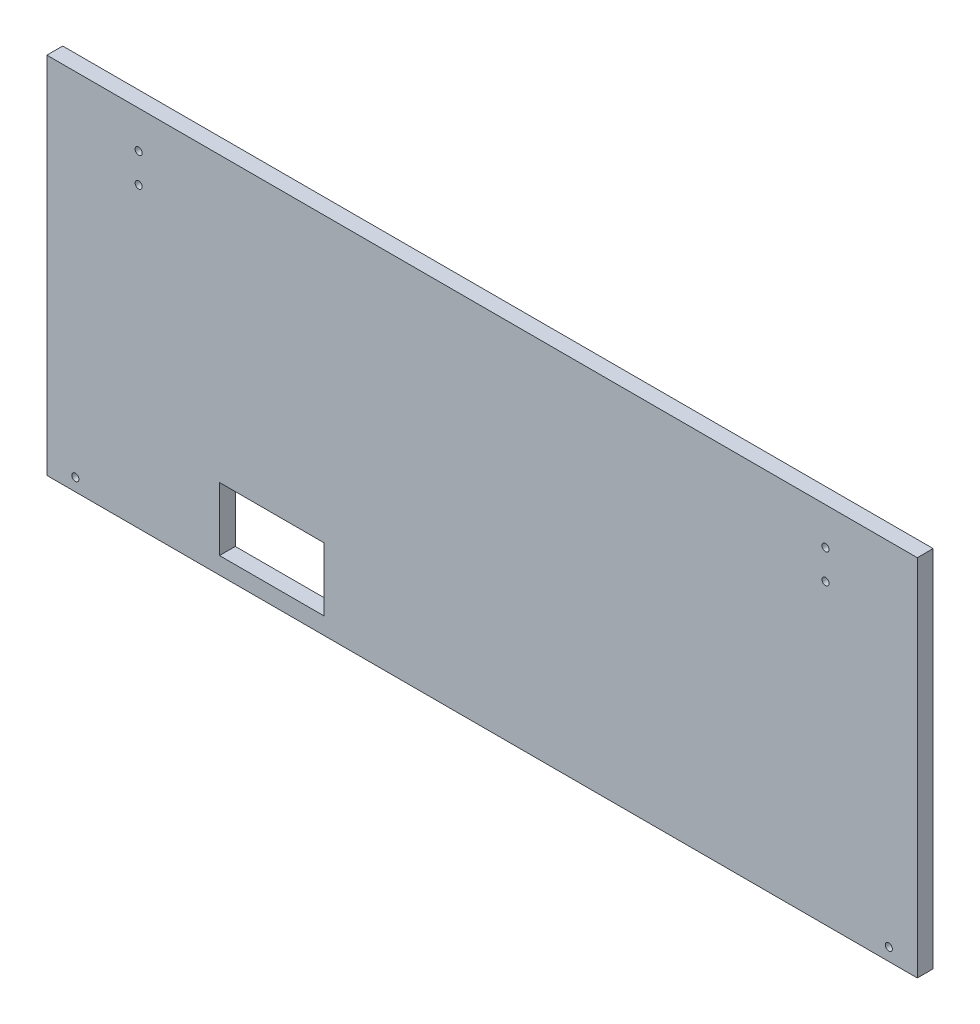
ISO-10303-21;
HEADER;
FILE_DESCRIPTION(('STEP AP214'),'2;1');
FILE_NAME('part.step','',(''),(''),'','','');
FILE_SCHEMA(('AUTOMOTIVE_DESIGN { 1 0 10303 214 1 1 1 1 }'));
ENDSEC;
DATA;
#1=APPLICATION_CONTEXT('core data for automotive mechanical design processes');
#2=APPLICATION_PROTOCOL_DEFINITION('international standard','automotive_design',2000,#1);
#3=PRODUCT_CONTEXT('',#1,'mechanical');
#4=PRODUCT('Part','Part','',(#3));
#5=PRODUCT_RELATED_PRODUCT_CATEGORY('part','',(#4));
#6=PRODUCT_DEFINITION_FORMATION('','',#4);
#7=PRODUCT_DEFINITION_CONTEXT('part definition',#1,'design');
#8=PRODUCT_DEFINITION('design','',#6,#7);
#9=PRODUCT_DEFINITION_SHAPE('','',#8);
#10=(LENGTH_UNIT() NAMED_UNIT(*) SI_UNIT(.MILLI.,.METRE.));
#11=(NAMED_UNIT(*) PLANE_ANGLE_UNIT() SI_UNIT($,.RADIAN.));
#12=(NAMED_UNIT(*) SI_UNIT($,.STERADIAN.) SOLID_ANGLE_UNIT());
#13=UNCERTAINTY_MEASURE_WITH_UNIT(LENGTH_MEASURE(1.E-05),#10,'distance_accuracy_value','');
#14=(GEOMETRIC_REPRESENTATION_CONTEXT(3) GLOBAL_UNCERTAINTY_ASSIGNED_CONTEXT((#13)) GLOBAL_UNIT_ASSIGNED_CONTEXT((#10,
#11,#12)) REPRESENTATION_CONTEXT('',''));
#15=CARTESIAN_POINT('',(0.,0.,0.));
#16=DIRECTION('',(0.,0.,1.));
#17=DIRECTION('',(1.,0.,0.));
#18=AXIS2_PLACEMENT_3D('',#15,#16,#17);
#19=CARTESIAN_POINT('',(275.,-115.,10.));
#20=DIRECTION('',(-1.,0.,0.));
#21=DIRECTION('',(0.,0.,1.));
#22=AXIS2_PLACEMENT_3D('',#19,#20,#21);
#23=PLANE('',#22);
#24=DIRECTION('',(0.,1.,0.));
#25=VECTOR('',#24,1.);
#26=CARTESIAN_POINT('',(275.,-115.,0.));
#27=LINE('',#26,#25);
#28=CARTESIAN_POINT('',(275.,-115.,0.));
#29=VERTEX_POINT('',#28);
#30=CARTESIAN_POINT('',(275.,115.,0.));
#31=VERTEX_POINT('',#30);
#32=EDGE_CURVE('E170',#29,#31,#27,.T.);
#33=ORIENTED_EDGE('',*,*,#32,.T.);
#34=DIRECTION('',(0.,0.,-1.));
#35=VECTOR('',#34,1.);
#36=CARTESIAN_POINT('',(275.,115.,10.));
#37=LINE('',#36,#35);
#38=CARTESIAN_POINT('',(275.,115.,10.));
#39=VERTEX_POINT('',#38);
#40=EDGE_CURVE('E11',#39,#31,#37,.T.);
#41=ORIENTED_EDGE('',*,*,#40,.F.);
#42=DIRECTION('',(0.,1.,0.));
#43=VECTOR('',#42,1.);
#44=CARTESIAN_POINT('',(275.,-115.,10.));
#45=LINE('',#44,#43);
#46=CARTESIAN_POINT('',(275.,-115.,10.));
#47=VERTEX_POINT('',#46);
#48=EDGE_CURVE('E173',#47,#39,#45,.T.);
#49=ORIENTED_EDGE('',*,*,#48,.F.);
#50=DIRECTION('',(0.,0.,-1.));
#51=VECTOR('',#50,1.);
#52=CARTESIAN_POINT('',(275.,-115.,10.));
#53=LINE('',#52,#51);
#54=EDGE_CURVE('E183',#47,#29,#53,.T.);
#55=ORIENTED_EDGE('',*,*,#54,.T.);
#56=EDGE_LOOP('',(#33,#41,#49,#55));
#57=FACE_BOUND('',#56,.T.);
#58=ADVANCED_FACE('F41',(#57),#23,.F.);
#59=CARTESIAN_POINT('',(275.,115.,10.));
#60=DIRECTION('',(0.,-1.,0.));
#61=DIRECTION('',(1.,0.,0.));
#62=AXIS2_PLACEMENT_3D('',#59,#60,#61);
#63=PLANE('',#62);
#64=DIRECTION('',(-1.,0.,0.));
#65=VECTOR('',#64,1.);
#66=CARTESIAN_POINT('',(275.,115.,0.));
#67=LINE('',#66,#65);
#68=CARTESIAN_POINT('',(-275.,115.,0.));
#69=VERTEX_POINT('',#68);
#70=EDGE_CURVE('E186',#31,#69,#67,.T.);
#71=ORIENTED_EDGE('',*,*,#70,.T.);
#72=DIRECTION('',(0.,0.,-1.));
#73=VECTOR('',#72,1.);
#74=CARTESIAN_POINT('',(-275.,115.,10.));
#75=LINE('',#74,#73);
#76=CARTESIAN_POINT('',(-275.,115.,10.));
#77=VERTEX_POINT('',#76);
#78=EDGE_CURVE('E48',#77,#69,#75,.T.);
#79=ORIENTED_EDGE('',*,*,#78,.F.);
#80=DIRECTION('',(-1.,0.,0.));
#81=VECTOR('',#80,1.);
#82=CARTESIAN_POINT('',(275.,115.,10.));
#83=LINE('',#82,#81);
#84=EDGE_CURVE('E176',#39,#77,#83,.T.);
#85=ORIENTED_EDGE('',*,*,#84,.F.);
#86=ORIENTED_EDGE('',*,*,#40,.T.);
#87=EDGE_LOOP('',(#71,#79,#85,#86));
#88=FACE_BOUND('',#87,.T.);
#89=ADVANCED_FACE('F215',(#88),#63,.F.);
#90=CARTESIAN_POINT('',(-275.,-115.,10.));
#91=DIRECTION('',(1.,0.,0.));
#92=DIRECTION('',(0.,0.,-1.));
#93=AXIS2_PLACEMENT_3D('',#90,#91,#92);
#94=PLANE('',#93);
#95=DIRECTION('',(0.,-1.,0.));
#96=VECTOR('',#95,1.);
#97=CARTESIAN_POINT('',(-275.,-115.,0.));
#98=LINE('',#97,#96);
#99=CARTESIAN_POINT('',(-275.,-115.,0.));
#100=VERTEX_POINT('',#99);
#101=EDGE_CURVE('E188',#69,#100,#98,.T.);
#102=ORIENTED_EDGE('',*,*,#101,.T.);
#103=DIRECTION('',(0.,0.,-1.));
#104=VECTOR('',#103,1.);
#105=CARTESIAN_POINT('',(-275.,-115.,10.));
#106=LINE('',#105,#104);
#107=CARTESIAN_POINT('',(-275.,-115.,10.));
#108=VERTEX_POINT('',#107);
#109=EDGE_CURVE('E193',#108,#100,#106,.T.);
#110=ORIENTED_EDGE('',*,*,#109,.F.);
#111=DIRECTION('',(0.,-1.,0.));
#112=VECTOR('',#111,1.);
#113=CARTESIAN_POINT('',(-275.,-115.,10.));
#114=LINE('',#113,#112);
#115=EDGE_CURVE('E179',#77,#108,#114,.T.);
#116=ORIENTED_EDGE('',*,*,#115,.F.);
#117=ORIENTED_EDGE('',*,*,#78,.T.);
#118=EDGE_LOOP('',(#102,#110,#116,#117));
#119=FACE_BOUND('',#118,.T.);
#120=ADVANCED_FACE('F200',(#119),#94,.F.);
#121=CARTESIAN_POINT('',(275.,-115.,10.));
#122=DIRECTION('',(0.,1.,0.));
#123=DIRECTION('',(-1.,0.,0.));
#124=AXIS2_PLACEMENT_3D('',#121,#122,#123);
#125=PLANE('',#124);
#126=DIRECTION('',(1.,0.,0.));
#127=VECTOR('',#126,1.);
#128=CARTESIAN_POINT('',(275.,-115.,0.));
#129=LINE('',#128,#127);
#130=EDGE_CURVE('E177',#100,#29,#129,.T.);
#131=ORIENTED_EDGE('',*,*,#130,.T.);
#132=ORIENTED_EDGE('',*,*,#54,.F.);
#133=DIRECTION('',(1.,0.,0.));
#134=VECTOR('',#133,1.);
#135=CARTESIAN_POINT('',(275.,-115.,10.));
#136=LINE('',#135,#134);
#137=EDGE_CURVE('E181',#108,#47,#136,.T.);
#138=ORIENTED_EDGE('',*,*,#137,.F.);
#139=ORIENTED_EDGE('',*,*,#109,.T.);
#140=EDGE_LOOP('',(#131,#132,#138,#139));
#141=FACE_BOUND('',#140,.T.);
#142=ADVANCED_FACE('F208',(#141),#125,.F.);
#143=CARTESIAN_POINT('',(0.,0.,10.));
#144=DIRECTION('',(0.,0.,1.));
#145=DIRECTION('',(1.,0.,0.));
#146=AXIS2_PLACEMENT_3D('',#143,#144,#145);
#147=PLANE('',#146);
#148=CARTESIAN_POINT('',(-257.,-107.,10.));
#149=DIRECTION('',(0.,0.,-1.));
#150=DIRECTION('',(-1.,0.,0.));
#151=AXIS2_PLACEMENT_3D('',#148,#149,#150);
#152=CIRCLE('',#151,2.24999999999995);
#153=CARTESIAN_POINT('',(-259.25,-107.,10.));
#154=VERTEX_POINT('',#153);
#155=EDGE_CURVE('E164',#154,#154,#152,.T.);
#156=ORIENTED_EDGE('',*,*,#155,.T.);
#157=EDGE_LOOP('',(#156));
#158=FACE_BOUND('',#157,.T.);
#159=CARTESIAN_POINT('',(257.,-107.,10.));
#160=DIRECTION('',(0.,0.,-1.));
#161=DIRECTION('',(-1.,0.,0.));
#162=AXIS2_PLACEMENT_3D('',#159,#160,#161);
#163=CIRCLE('',#162,2.24999999999995);
#164=CARTESIAN_POINT('',(254.75,-107.,10.));
#165=VERTEX_POINT('',#164);
#166=EDGE_CURVE('E158',#165,#165,#163,.T.);
#167=ORIENTED_EDGE('',*,*,#166,.T.);
#168=EDGE_LOOP('',(#167));
#169=FACE_BOUND('',#168,.T.);
#170=CARTESIAN_POINT('',(217.,72.9999999999999,10.));
#171=DIRECTION('',(0.,0.,-1.));
#172=DIRECTION('',(-1.,0.,0.));
#173=AXIS2_PLACEMENT_3D('',#170,#171,#172);
#174=CIRCLE('',#173,2.25000000000001);
#175=CARTESIAN_POINT('',(214.75,72.9999999999999,10.));
#176=VERTEX_POINT('',#175);
#177=EDGE_CURVE('E147',#176,#176,#174,.T.);
#178=ORIENTED_EDGE('',*,*,#177,.T.);
#179=EDGE_LOOP('',(#178));
#180=FACE_BOUND('',#179,.T.);
#181=CARTESIAN_POINT('',(-217.,91.4999999999999,10.));
#182=DIRECTION('',(0.,0.,-1.));
#183=DIRECTION('',(-1.,0.,0.));
#184=AXIS2_PLACEMENT_3D('',#181,#182,#183);
#185=CIRCLE('',#184,2.25000000000001);
#186=CARTESIAN_POINT('',(-219.25,91.4999999999999,10.));
#187=VERTEX_POINT('',#186);
#188=EDGE_CURVE('E153',#187,#187,#185,.T.);
#189=ORIENTED_EDGE('',*,*,#188,.T.);
#190=EDGE_LOOP('',(#189));
#191=FACE_BOUND('',#190,.T.);
#192=CARTESIAN_POINT('',(-217.,72.9999999999999,10.));
#193=DIRECTION('',(0.,0.,-1.));
#194=DIRECTION('',(-1.,0.,0.));
#195=AXIS2_PLACEMENT_3D('',#192,#193,#194);
#196=CIRCLE('',#195,2.25000000000001);
#197=CARTESIAN_POINT('',(-219.25,72.9999999999999,10.));
#198=VERTEX_POINT('',#197);
#199=EDGE_CURVE('E127',#198,#198,#196,.T.);
#200=ORIENTED_EDGE('',*,*,#199,.T.);
#201=EDGE_LOOP('',(#200));
#202=FACE_BOUND('',#201,.T.);
#203=DIRECTION('',(0.,-1.,0.));
#204=VECTOR('',#203,1.);
#205=CARTESIAN_POINT('',(-99.925688,-104.3,10.));
#206=LINE('',#205,#204);
#207=CARTESIAN_POINT('',(-99.925688,-64.3,10.));
#208=VERTEX_POINT('',#207);
#209=CARTESIAN_POINT('',(-99.925688,-104.3,10.));
#210=VERTEX_POINT('',#209);
#211=EDGE_CURVE('E107',#208,#210,#206,.T.);
#212=ORIENTED_EDGE('',*,*,#211,.T.);
#213=DIRECTION('',(-1.,0.,0.));
#214=VECTOR('',#213,1.);
#215=CARTESIAN_POINT('',(-99.925688,-104.3,10.));
#216=LINE('',#215,#214);
#217=CARTESIAN_POINT('',(-165.925688,-104.3,10.));
#218=VERTEX_POINT('',#217);
#219=EDGE_CURVE('E139',#210,#218,#216,.T.);
#220=ORIENTED_EDGE('',*,*,#219,.T.);
#221=DIRECTION('',(0.,1.,0.));
#222=VECTOR('',#221,1.);
#223=CARTESIAN_POINT('',(-165.925688,-104.3,10.));
#224=LINE('',#223,#222);
#225=CARTESIAN_POINT('',(-165.925688,-64.3,10.));
#226=VERTEX_POINT('',#225);
#227=EDGE_CURVE('E55',#218,#226,#224,.T.);
#228=ORIENTED_EDGE('',*,*,#227,.T.);
#229=DIRECTION('',(1.,0.,0.));
#230=VECTOR('',#229,1.);
#231=CARTESIAN_POINT('',(-99.925688,-64.3,10.));
#232=LINE('',#231,#230);
#233=EDGE_CURVE('E135',#226,#208,#232,.T.);
#234=ORIENTED_EDGE('',*,*,#233,.T.);
#235=EDGE_LOOP('',(#212,#220,#228,#234));
#236=FACE_BOUND('',#235,.T.);
#237=CARTESIAN_POINT('',(217.,91.4999999999999,10.));
#238=DIRECTION('',(0.,0.,-1.));
#239=DIRECTION('',(-1.,0.,0.));
#240=AXIS2_PLACEMENT_3D('',#237,#238,#239);
#241=CIRCLE('',#240,2.25000000000001);
#242=CARTESIAN_POINT('',(214.75,91.4999999999999,10.));
#243=VERTEX_POINT('',#242);
#244=EDGE_CURVE('E167',#243,#243,#241,.T.);
#245=ORIENTED_EDGE('',*,*,#244,.T.);
#246=EDGE_LOOP('',(#245));
#247=FACE_BOUND('',#246,.T.);
#248=ORIENTED_EDGE('',*,*,#48,.T.);
#249=ORIENTED_EDGE('',*,*,#84,.T.);
#250=ORIENTED_EDGE('',*,*,#115,.T.);
#251=ORIENTED_EDGE('',*,*,#137,.T.);
#252=EDGE_LOOP('',(#248,#249,#250,#251));
#253=FACE_BOUND('',#252,.T.);
#254=ADVANCED_FACE('F214',(#158,#169,#180,#191,#202,#236,#247,#253),#147,.T.);
#255=CARTESIAN_POINT('',(0.,0.,0.));
#256=DIRECTION('',(0.,0.,1.));
#257=DIRECTION('',(1.,0.,0.));
#258=AXIS2_PLACEMENT_3D('',#255,#256,#257);
#259=PLANE('',#258);
#260=CARTESIAN_POINT('',(-257.,-107.,0.));
#261=DIRECTION('',(0.,0.,-1.));
#262=DIRECTION('',(-1.,0.,0.));
#263=AXIS2_PLACEMENT_3D('',#260,#261,#262);
#264=CIRCLE('',#263,2.24999999999995);
#265=CARTESIAN_POINT('',(-259.25,-107.,0.));
#266=VERTEX_POINT('',#265);
#267=EDGE_CURVE('E161',#266,#266,#264,.T.);
#268=ORIENTED_EDGE('',*,*,#267,.F.);
#269=EDGE_LOOP('',(#268));
#270=FACE_BOUND('',#269,.T.);
#271=CARTESIAN_POINT('',(257.,-107.,0.));
#272=DIRECTION('',(0.,0.,-1.));
#273=DIRECTION('',(-1.,0.,0.));
#274=AXIS2_PLACEMENT_3D('',#271,#272,#273);
#275=CIRCLE('',#274,2.24999999999995);
#276=CARTESIAN_POINT('',(254.75,-107.,0.));
#277=VERTEX_POINT('',#276);
#278=EDGE_CURVE('E112',#277,#277,#275,.T.);
#279=ORIENTED_EDGE('',*,*,#278,.F.);
#280=EDGE_LOOP('',(#279));
#281=FACE_BOUND('',#280,.T.);
#282=CARTESIAN_POINT('',(217.,72.9999999999999,0.));
#283=DIRECTION('',(0.,0.,-1.));
#284=DIRECTION('',(-1.,0.,0.));
#285=AXIS2_PLACEMENT_3D('',#282,#283,#284);
#286=CIRCLE('',#285,2.25000000000001);
#287=CARTESIAN_POINT('',(214.75,72.9999999999999,0.));
#288=VERTEX_POINT('',#287);
#289=EDGE_CURVE('E143',#288,#288,#286,.T.);
#290=ORIENTED_EDGE('',*,*,#289,.F.);
#291=EDGE_LOOP('',(#290));
#292=FACE_BOUND('',#291,.T.);
#293=CARTESIAN_POINT('',(-217.,91.4999999999999,0.));
#294=DIRECTION('',(0.,0.,-1.));
#295=DIRECTION('',(-1.,0.,0.));
#296=AXIS2_PLACEMENT_3D('',#293,#294,#295);
#297=CIRCLE('',#296,2.25000000000001);
#298=CARTESIAN_POINT('',(-219.25,91.4999999999999,0.));
#299=VERTEX_POINT('',#298);
#300=EDGE_CURVE('E150',#299,#299,#297,.T.);
#301=ORIENTED_EDGE('',*,*,#300,.F.);
#302=EDGE_LOOP('',(#301));
#303=FACE_BOUND('',#302,.T.);
#304=CARTESIAN_POINT('',(-217.,72.9999999999999,0.));
#305=DIRECTION('',(0.,0.,-1.));
#306=DIRECTION('',(-1.,0.,0.));
#307=AXIS2_PLACEMENT_3D('',#304,#305,#306);
#308=CIRCLE('',#307,2.25000000000001);
#309=CARTESIAN_POINT('',(-219.25,72.9999999999999,0.));
#310=VERTEX_POINT('',#309);
#311=EDGE_CURVE('E130',#310,#310,#308,.T.);
#312=ORIENTED_EDGE('',*,*,#311,.F.);
#313=EDGE_LOOP('',(#312));
#314=FACE_BOUND('',#313,.T.);
#315=DIRECTION('',(-1.,0.,0.));
#316=VECTOR('',#315,1.);
#317=CARTESIAN_POINT('',(-99.925688,-104.3,0.));
#318=LINE('',#317,#316);
#319=CARTESIAN_POINT('',(-99.925688,-104.3,0.));
#320=VERTEX_POINT('',#319);
#321=CARTESIAN_POINT('',(-165.925688,-104.3,0.));
#322=VERTEX_POINT('',#321);
#323=EDGE_CURVE('E126',#320,#322,#318,.T.);
#324=ORIENTED_EDGE('',*,*,#323,.F.);
#325=DIRECTION('',(0.,-1.,0.));
#326=VECTOR('',#325,1.);
#327=CARTESIAN_POINT('',(-99.925688,-104.3,0.));
#328=LINE('',#327,#326);
#329=CARTESIAN_POINT('',(-99.925688,-64.3,0.));
#330=VERTEX_POINT('',#329);
#331=EDGE_CURVE('E63',#330,#320,#328,.T.);
#332=ORIENTED_EDGE('',*,*,#331,.F.);
#333=DIRECTION('',(1.,0.,0.));
#334=VECTOR('',#333,1.);
#335=CARTESIAN_POINT('',(-99.925688,-64.3,0.));
#336=LINE('',#335,#334);
#337=CARTESIAN_POINT('',(-165.925688,-64.3,0.));
#338=VERTEX_POINT('',#337);
#339=EDGE_CURVE('E115',#338,#330,#336,.T.);
#340=ORIENTED_EDGE('',*,*,#339,.F.);
#341=DIRECTION('',(0.,1.,0.));
#342=VECTOR('',#341,1.);
#343=CARTESIAN_POINT('',(-165.925688,-104.3,0.));
#344=LINE('',#343,#342);
#345=EDGE_CURVE('E120',#322,#338,#344,.T.);
#346=ORIENTED_EDGE('',*,*,#345,.F.);
#347=EDGE_LOOP('',(#324,#332,#340,#346));
#348=FACE_BOUND('',#347,.T.);
#349=CARTESIAN_POINT('',(217.,91.4999999999999,0.));
#350=DIRECTION('',(0.,0.,-1.));
#351=DIRECTION('',(-1.,0.,0.));
#352=AXIS2_PLACEMENT_3D('',#349,#350,#351);
#353=CIRCLE('',#352,2.25000000000001);
#354=CARTESIAN_POINT('',(214.75,91.4999999999999,0.));
#355=VERTEX_POINT('',#354);
#356=EDGE_CURVE('E146',#355,#355,#353,.T.);
#357=ORIENTED_EDGE('',*,*,#356,.F.);
#358=EDGE_LOOP('',(#357));
#359=FACE_BOUND('',#358,.T.);
#360=ORIENTED_EDGE('',*,*,#32,.F.);
#361=ORIENTED_EDGE('',*,*,#130,.F.);
#362=ORIENTED_EDGE('',*,*,#101,.F.);
#363=ORIENTED_EDGE('',*,*,#70,.F.);
#364=EDGE_LOOP('',(#360,#361,#362,#363));
#365=FACE_BOUND('',#364,.T.);
#366=ADVANCED_FACE('F123',(#270,#281,#292,#303,#314,#348,#359,#365),#259,.F.);
#367=CARTESIAN_POINT('',(217.,91.4999999999999,10.));
#368=DIRECTION('',(0.,0.,-1.));
#369=DIRECTION('',(-1.,0.,0.));
#370=AXIS2_PLACEMENT_3D('',#367,#368,#369);
#371=CYLINDRICAL_SURFACE('',#370,2.25000000000001);
#372=ORIENTED_EDGE('',*,*,#244,.F.);
#373=EDGE_LOOP('',(#372));
#374=FACE_BOUND('',#373,.T.);
#375=ORIENTED_EDGE('',*,*,#356,.T.);
#376=EDGE_LOOP('',(#375));
#377=FACE_BOUND('',#376,.T.);
#378=ADVANCED_FACE('F227',(#374,#377),#371,.F.);
#379=CARTESIAN_POINT('',(-99.925688,-104.3,10.));
#380=DIRECTION('',(1.,0.,0.));
#381=DIRECTION('',(0.,0.,-1.));
#382=AXIS2_PLACEMENT_3D('',#379,#380,#381);
#383=PLANE('',#382);
#384=ORIENTED_EDGE('',*,*,#331,.T.);
#385=DIRECTION('',(0.,0.,-1.));
#386=VECTOR('',#385,1.);
#387=CARTESIAN_POINT('',(-99.925688,-104.3,10.));
#388=LINE('',#387,#386);
#389=EDGE_CURVE('E137',#210,#320,#388,.T.);
#390=ORIENTED_EDGE('',*,*,#389,.F.);
#391=ORIENTED_EDGE('',*,*,#211,.F.);
#392=DIRECTION('',(0.,0.,-1.));
#393=VECTOR('',#392,1.);
#394=CARTESIAN_POINT('',(-99.925688,-64.3,10.));
#395=LINE('',#394,#393);
#396=EDGE_CURVE('E103',#208,#330,#395,.T.);
#397=ORIENTED_EDGE('',*,*,#396,.T.);
#398=EDGE_LOOP('',(#384,#390,#391,#397));
#399=FACE_BOUND('',#398,.T.);
#400=ADVANCED_FACE('F105',(#399),#383,.F.);
#401=CARTESIAN_POINT('',(-99.925688,-64.3,10.));
#402=DIRECTION('',(0.,1.,0.));
#403=DIRECTION('',(0.,0.,1.));
#404=AXIS2_PLACEMENT_3D('',#401,#402,#403);
#405=PLANE('',#404);
#406=ORIENTED_EDGE('',*,*,#339,.T.);
#407=ORIENTED_EDGE('',*,*,#396,.F.);
#408=ORIENTED_EDGE('',*,*,#233,.F.);
#409=DIRECTION('',(0.,0.,-1.));
#410=VECTOR('',#409,1.);
#411=CARTESIAN_POINT('',(-165.925688,-64.3,10.));
#412=LINE('',#411,#410);
#413=EDGE_CURVE('E111',#226,#338,#412,.T.);
#414=ORIENTED_EDGE('',*,*,#413,.T.);
#415=EDGE_LOOP('',(#406,#407,#408,#414));
#416=FACE_BOUND('',#415,.T.);
#417=ADVANCED_FACE('F116',(#416),#405,.F.);
#418=CARTESIAN_POINT('',(-165.925688,-104.3,10.));
#419=DIRECTION('',(-1.,0.,0.));
#420=DIRECTION('',(0.,0.,1.));
#421=AXIS2_PLACEMENT_3D('',#418,#419,#420);
#422=PLANE('',#421);
#423=ORIENTED_EDGE('',*,*,#345,.T.);
#424=ORIENTED_EDGE('',*,*,#413,.F.);
#425=ORIENTED_EDGE('',*,*,#227,.F.);
#426=DIRECTION('',(0.,0.,-1.));
#427=VECTOR('',#426,1.);
#428=CARTESIAN_POINT('',(-165.925688,-104.3,10.));
#429=LINE('',#428,#427);
#430=EDGE_CURVE('E275',#218,#322,#429,.T.);
#431=ORIENTED_EDGE('',*,*,#430,.T.);
#432=EDGE_LOOP('',(#423,#424,#425,#431));
#433=FACE_BOUND('',#432,.T.);
#434=ADVANCED_FACE('F254',(#433),#422,.F.);
#435=CARTESIAN_POINT('',(-99.925688,-104.3,10.));
#436=DIRECTION('',(0.,-1.,0.));
#437=DIRECTION('',(1.,0.,0.));
#438=AXIS2_PLACEMENT_3D('',#435,#436,#437);
#439=PLANE('',#438);
#440=ORIENTED_EDGE('',*,*,#323,.T.);
#441=ORIENTED_EDGE('',*,*,#430,.F.);
#442=ORIENTED_EDGE('',*,*,#219,.F.);
#443=ORIENTED_EDGE('',*,*,#389,.T.);
#444=EDGE_LOOP('',(#440,#441,#442,#443));
#445=FACE_BOUND('',#444,.T.);
#446=ADVANCED_FACE('F257',(#445),#439,.F.);
#447=CARTESIAN_POINT('',(-217.,72.9999999999999,10.));
#448=DIRECTION('',(0.,0.,-1.));
#449=DIRECTION('',(-1.,0.,0.));
#450=AXIS2_PLACEMENT_3D('',#447,#448,#449);
#451=CYLINDRICAL_SURFACE('',#450,2.25000000000001);
#452=ORIENTED_EDGE('',*,*,#199,.F.);
#453=EDGE_LOOP('',(#452));
#454=FACE_BOUND('',#453,.T.);
#455=ORIENTED_EDGE('',*,*,#311,.T.);
#456=EDGE_LOOP('',(#455));
#457=FACE_BOUND('',#456,.T.);
#458=ADVANCED_FACE('F247',(#454,#457),#451,.F.);
#459=CARTESIAN_POINT('',(-217.,91.4999999999999,10.));
#460=DIRECTION('',(0.,0.,-1.));
#461=DIRECTION('',(-1.,0.,0.));
#462=AXIS2_PLACEMENT_3D('',#459,#460,#461);
#463=CYLINDRICAL_SURFACE('',#462,2.25000000000001);
#464=ORIENTED_EDGE('',*,*,#188,.F.);
#465=EDGE_LOOP('',(#464));
#466=FACE_BOUND('',#465,.T.);
#467=ORIENTED_EDGE('',*,*,#300,.T.);
#468=EDGE_LOOP('',(#467));
#469=FACE_BOUND('',#468,.T.);
#470=ADVANCED_FACE('F244',(#466,#469),#463,.F.);
#471=CARTESIAN_POINT('',(217.,72.9999999999999,10.));
#472=DIRECTION('',(0.,0.,-1.));
#473=DIRECTION('',(-1.,0.,0.));
#474=AXIS2_PLACEMENT_3D('',#471,#472,#473);
#475=CYLINDRICAL_SURFACE('',#474,2.25000000000001);
#476=ORIENTED_EDGE('',*,*,#177,.F.);
#477=EDGE_LOOP('',(#476));
#478=FACE_BOUND('',#477,.T.);
#479=ORIENTED_EDGE('',*,*,#289,.T.);
#480=EDGE_LOOP('',(#479));
#481=FACE_BOUND('',#480,.T.);
#482=ADVANCED_FACE('F242',(#478,#481),#475,.F.);
#483=CARTESIAN_POINT('',(257.,-107.,10.));
#484=DIRECTION('',(0.,0.,-1.));
#485=DIRECTION('',(-1.,0.,0.));
#486=AXIS2_PLACEMENT_3D('',#483,#484,#485);
#487=CYLINDRICAL_SURFACE('',#486,2.24999999999995);
#488=ORIENTED_EDGE('',*,*,#166,.F.);
#489=EDGE_LOOP('',(#488));
#490=FACE_BOUND('',#489,.T.);
#491=ORIENTED_EDGE('',*,*,#278,.T.);
#492=EDGE_LOOP('',(#491));
#493=FACE_BOUND('',#492,.T.);
#494=ADVANCED_FACE('F238',(#490,#493),#487,.F.);
#495=CARTESIAN_POINT('',(-257.,-107.,10.));
#496=DIRECTION('',(0.,0.,-1.));
#497=DIRECTION('',(-1.,0.,0.));
#498=AXIS2_PLACEMENT_3D('',#495,#496,#497);
#499=CYLINDRICAL_SURFACE('',#498,2.24999999999995);
#500=ORIENTED_EDGE('',*,*,#155,.F.);
#501=EDGE_LOOP('',(#500));
#502=FACE_BOUND('',#501,.T.);
#503=ORIENTED_EDGE('',*,*,#267,.T.);
#504=EDGE_LOOP('',(#503));
#505=FACE_BOUND('',#504,.T.);
#506=ADVANCED_FACE('F235',(#502,#505),#499,.F.);
#507=CLOSED_SHELL('',(#58,#89,#120,#142,#254,#366,#378,#400,#417,#434,#446,#458,#470,#482,#494,#506));
#508=MANIFOLD_SOLID_BREP('B2',#507);
#509=ADVANCED_BREP_SHAPE_REPRESENTATION('',(#18,#508),#14);
#510=SHAPE_DEFINITION_REPRESENTATION(#9,#509);
ENDSEC;
END-ISO-10303-21;
